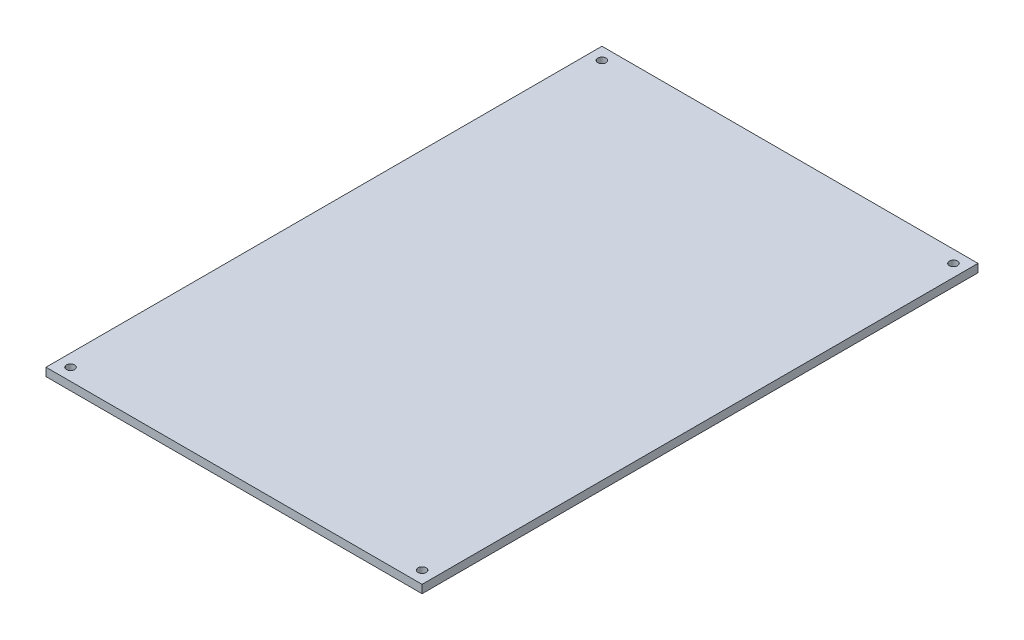
ISO-10303-21;
HEADER;
FILE_DESCRIPTION(('STEP AP214'),'2;1');
FILE_NAME('part.step','',(''),(''),'','','');
FILE_SCHEMA(('AUTOMOTIVE_DESIGN { 1 0 10303 214 1 1 1 1 }'));
ENDSEC;
DATA;
#1=APPLICATION_CONTEXT('core data for automotive mechanical design processes');
#2=APPLICATION_PROTOCOL_DEFINITION('international standard','automotive_design',2000,#1);
#3=PRODUCT_CONTEXT('',#1,'mechanical');
#4=PRODUCT('Part','Part','',(#3));
#5=PRODUCT_RELATED_PRODUCT_CATEGORY('part','',(#4));
#6=PRODUCT_DEFINITION_FORMATION('','',#4);
#7=PRODUCT_DEFINITION_CONTEXT('part definition',#1,'design');
#8=PRODUCT_DEFINITION('design','',#6,#7);
#9=PRODUCT_DEFINITION_SHAPE('','',#8);
#10=(LENGTH_UNIT() NAMED_UNIT(*) SI_UNIT(.MILLI.,.METRE.));
#11=(NAMED_UNIT(*) PLANE_ANGLE_UNIT() SI_UNIT($,.RADIAN.));
#12=(NAMED_UNIT(*) SI_UNIT($,.STERADIAN.) SOLID_ANGLE_UNIT());
#13=UNCERTAINTY_MEASURE_WITH_UNIT(LENGTH_MEASURE(1.E-05),#10,'distance_accuracy_value','');
#14=(GEOMETRIC_REPRESENTATION_CONTEXT(3) GLOBAL_UNCERTAINTY_ASSIGNED_CONTEXT((#13)) GLOBAL_UNIT_ASSIGNED_CONTEXT((#10,
#11,#12)) REPRESENTATION_CONTEXT('',''));
#15=CARTESIAN_POINT('',(0.,0.,0.));
#16=DIRECTION('',(0.,0.,1.));
#17=DIRECTION('',(1.,0.,0.));
#18=AXIS2_PLACEMENT_3D('',#15,#16,#17);
#19=CARTESIAN_POINT('',(0.,6.35,0.));
#20=DIRECTION('',(0.,-1.,0.));
#21=DIRECTION('',(0.,0.,-1.));
#22=AXIS2_PLACEMENT_3D('',#19,#20,#21);
#23=PLANE('',#22);
#24=DIRECTION('',(0.,0.,-1.));
#25=VECTOR('',#24,1.);
#26=CARTESIAN_POINT('',(146.05,6.35,215.9));
#27=LINE('',#26,#25);
#28=CARTESIAN_POINT('',(146.05,6.35,215.9));
#29=VERTEX_POINT('',#28);
#30=CARTESIAN_POINT('',(146.05,6.35,-215.9));
#31=VERTEX_POINT('',#30);
#32=EDGE_CURVE('E85',#29,#31,#27,.T.);
#33=ORIENTED_EDGE('',*,*,#32,.T.);
#34=DIRECTION('',(-1.,0.,0.));
#35=VECTOR('',#34,1.);
#36=CARTESIAN_POINT('',(-146.05,6.35,-215.9));
#37=LINE('',#36,#35);
#38=CARTESIAN_POINT('',(-146.05,6.35,-215.9));
#39=VERTEX_POINT('',#38);
#40=EDGE_CURVE('E80',#31,#39,#37,.T.);
#41=ORIENTED_EDGE('',*,*,#40,.T.);
#42=DIRECTION('',(0.,0.,1.));
#43=VECTOR('',#42,1.);
#44=CARTESIAN_POINT('',(-146.05,6.35,215.9));
#45=LINE('',#44,#43);
#46=CARTESIAN_POINT('',(-146.05,6.35,215.9));
#47=VERTEX_POINT('',#46);
#48=EDGE_CURVE('E83',#39,#47,#45,.T.);
#49=ORIENTED_EDGE('',*,*,#48,.T.);
#50=DIRECTION('',(1.,0.,0.));
#51=VECTOR('',#50,1.);
#52=CARTESIAN_POINT('',(-146.05,6.35,215.9));
#53=LINE('',#52,#51);
#54=EDGE_CURVE('E50',#47,#29,#53,.T.);
#55=ORIENTED_EDGE('',*,*,#54,.T.);
#56=EDGE_LOOP('',(#33,#41,#49,#55));
#57=FACE_BOUND('',#56,.T.);
#58=CARTESIAN_POINT('',(-136.525,6.35,-206.375));
#59=DIRECTION('',(0.,1.,0.));
#60=DIRECTION('',(0.,0.,1.));
#61=AXIS2_PLACEMENT_3D('',#58,#59,#60);
#62=CIRCLE('',#61,3.18261999999999);
#63=CARTESIAN_POINT('',(-136.525,6.35,-203.19238));
#64=VERTEX_POINT('',#63);
#65=EDGE_CURVE('E100',#64,#64,#62,.T.);
#66=ORIENTED_EDGE('',*,*,#65,.F.);
#67=EDGE_LOOP('',(#66));
#68=FACE_BOUND('',#67,.T.);
#69=CARTESIAN_POINT('',(136.525,6.35,-206.375));
#70=DIRECTION('',(0.,1.,0.));
#71=DIRECTION('',(0.,0.,1.));
#72=AXIS2_PLACEMENT_3D('',#69,#70,#71);
#73=CIRCLE('',#72,3.18261999999999);
#74=CARTESIAN_POINT('',(136.525,6.35,-203.19238));
#75=VERTEX_POINT('',#74);
#76=EDGE_CURVE('E115',#75,#75,#73,.T.);
#77=ORIENTED_EDGE('',*,*,#76,.F.);
#78=EDGE_LOOP('',(#77));
#79=FACE_BOUND('',#78,.T.);
#80=CARTESIAN_POINT('',(136.525,6.35,206.375));
#81=DIRECTION('',(0.,1.,0.));
#82=DIRECTION('',(0.,0.,1.));
#83=AXIS2_PLACEMENT_3D('',#80,#81,#82);
#84=CIRCLE('',#83,3.18261999999999);
#85=CARTESIAN_POINT('',(136.525,6.35,209.55762));
#86=VERTEX_POINT('',#85);
#87=EDGE_CURVE('E121',#86,#86,#84,.T.);
#88=ORIENTED_EDGE('',*,*,#87,.F.);
#89=EDGE_LOOP('',(#88));
#90=FACE_BOUND('',#89,.T.);
#91=CARTESIAN_POINT('',(-136.525,6.35,206.375));
#92=DIRECTION('',(0.,1.,0.));
#93=DIRECTION('',(0.,0.,1.));
#94=AXIS2_PLACEMENT_3D('',#91,#92,#93);
#95=CIRCLE('',#94,3.18261999999999);
#96=CARTESIAN_POINT('',(-136.525,6.35,209.55762));
#97=VERTEX_POINT('',#96);
#98=EDGE_CURVE('E127',#97,#97,#95,.T.);
#99=ORIENTED_EDGE('',*,*,#98,.F.);
#100=EDGE_LOOP('',(#99));
#101=FACE_BOUND('',#100,.T.);
#102=ADVANCED_FACE('F33',(#57,#68,#79,#90,#101),#23,.F.);
#103=CARTESIAN_POINT('',(0.,0.,0.));
#104=DIRECTION('',(0.,-1.,0.));
#105=DIRECTION('',(0.,0.,-1.));
#106=AXIS2_PLACEMENT_3D('',#103,#104,#105);
#107=PLANE('',#106);
#108=CARTESIAN_POINT('',(136.525,0.,206.375));
#109=DIRECTION('',(0.,1.,0.));
#110=DIRECTION('',(0.,0.,1.));
#111=AXIS2_PLACEMENT_3D('',#108,#109,#110);
#112=CIRCLE('',#111,3.18261999999999);
#113=CARTESIAN_POINT('',(136.525,0.,209.55762));
#114=VERTEX_POINT('',#113);
#115=EDGE_CURVE('E124',#114,#114,#112,.T.);
#116=ORIENTED_EDGE('',*,*,#115,.T.);
#117=EDGE_LOOP('',(#116));
#118=FACE_BOUND('',#117,.T.);
#119=CARTESIAN_POINT('',(-136.525,0.,-206.375));
#120=DIRECTION('',(0.,1.,0.));
#121=DIRECTION('',(0.,0.,1.));
#122=AXIS2_PLACEMENT_3D('',#119,#120,#121);
#123=CIRCLE('',#122,3.18261999999999);
#124=CARTESIAN_POINT('',(-136.525,0.,-203.19238));
#125=VERTEX_POINT('',#124);
#126=EDGE_CURVE('E112',#125,#125,#123,.T.);
#127=ORIENTED_EDGE('',*,*,#126,.T.);
#128=EDGE_LOOP('',(#127));
#129=FACE_BOUND('',#128,.T.);
#130=DIRECTION('',(0.,0.,-1.));
#131=VECTOR('',#130,1.);
#132=CARTESIAN_POINT('',(146.05,0.,215.9));
#133=LINE('',#132,#131);
#134=CARTESIAN_POINT('',(146.05,0.,215.9));
#135=VERTEX_POINT('',#134);
#136=CARTESIAN_POINT('',(146.05,0.,-215.9));
#137=VERTEX_POINT('',#136);
#138=EDGE_CURVE('E97',#135,#137,#133,.T.);
#139=ORIENTED_EDGE('',*,*,#138,.F.);
#140=DIRECTION('',(1.,0.,0.));
#141=VECTOR('',#140,1.);
#142=CARTESIAN_POINT('',(-146.05,0.,215.9));
#143=LINE('',#142,#141);
#144=CARTESIAN_POINT('',(-146.05,0.,215.9));
#145=VERTEX_POINT('',#144);
#146=EDGE_CURVE('E73',#145,#135,#143,.T.);
#147=ORIENTED_EDGE('',*,*,#146,.F.);
#148=DIRECTION('',(0.,0.,1.));
#149=VECTOR('',#148,1.);
#150=CARTESIAN_POINT('',(-146.05,0.,215.9));
#151=LINE('',#150,#149);
#152=CARTESIAN_POINT('',(-146.05,0.,-215.9));
#153=VERTEX_POINT('',#152);
#154=EDGE_CURVE('E67',#153,#145,#151,.T.);
#155=ORIENTED_EDGE('',*,*,#154,.F.);
#156=DIRECTION('',(-1.,0.,0.));
#157=VECTOR('',#156,1.);
#158=CARTESIAN_POINT('',(-146.05,0.,-215.9));
#159=LINE('',#158,#157);
#160=EDGE_CURVE('E89',#137,#153,#159,.T.);
#161=ORIENTED_EDGE('',*,*,#160,.F.);
#162=EDGE_LOOP('',(#139,#147,#155,#161));
#163=FACE_BOUND('',#162,.T.);
#164=CARTESIAN_POINT('',(136.525,0.,-206.375));
#165=DIRECTION('',(0.,1.,0.));
#166=DIRECTION('',(0.,0.,1.));
#167=AXIS2_PLACEMENT_3D('',#164,#165,#166);
#168=CIRCLE('',#167,3.18261999999999);
#169=CARTESIAN_POINT('',(136.525,0.,-203.19238));
#170=VERTEX_POINT('',#169);
#171=EDGE_CURVE('E118',#170,#170,#168,.T.);
#172=ORIENTED_EDGE('',*,*,#171,.T.);
#173=EDGE_LOOP('',(#172));
#174=FACE_BOUND('',#173,.T.);
#175=CARTESIAN_POINT('',(-136.525,0.,206.375));
#176=DIRECTION('',(0.,1.,0.));
#177=DIRECTION('',(0.,0.,1.));
#178=AXIS2_PLACEMENT_3D('',#175,#176,#177);
#179=CIRCLE('',#178,3.18261999999999);
#180=CARTESIAN_POINT('',(-136.525,0.,209.55762));
#181=VERTEX_POINT('',#180);
#182=EDGE_CURVE('E130',#181,#181,#179,.T.);
#183=ORIENTED_EDGE('',*,*,#182,.T.);
#184=EDGE_LOOP('',(#183));
#185=FACE_BOUND('',#184,.T.);
#186=ADVANCED_FACE('F108',(#118,#129,#163,#174,#185),#107,.T.);
#187=CARTESIAN_POINT('',(146.05,6.35,215.9));
#188=DIRECTION('',(-1.,0.,0.));
#189=DIRECTION('',(0.,0.,1.));
#190=AXIS2_PLACEMENT_3D('',#187,#188,#189);
#191=PLANE('',#190);
#192=ORIENTED_EDGE('',*,*,#138,.T.);
#193=DIRECTION('',(0.,-1.,0.));
#194=VECTOR('',#193,1.);
#195=CARTESIAN_POINT('',(146.05,6.35,-215.9));
#196=LINE('',#195,#194);
#197=EDGE_CURVE('E11',#31,#137,#196,.T.);
#198=ORIENTED_EDGE('',*,*,#197,.F.);
#199=ORIENTED_EDGE('',*,*,#32,.F.);
#200=DIRECTION('',(0.,-1.,0.));
#201=VECTOR('',#200,1.);
#202=CARTESIAN_POINT('',(146.05,6.35,215.9));
#203=LINE('',#202,#201);
#204=EDGE_CURVE('E93',#29,#135,#203,.T.);
#205=ORIENTED_EDGE('',*,*,#204,.T.);
#206=EDGE_LOOP('',(#192,#198,#199,#205));
#207=FACE_BOUND('',#206,.T.);
#208=ADVANCED_FACE('F35',(#207),#191,.F.);
#209=CARTESIAN_POINT('',(-146.05,6.35,-215.9));
#210=DIRECTION('',(0.,0.,1.));
#211=DIRECTION('',(1.,0.,0.));
#212=AXIS2_PLACEMENT_3D('',#209,#210,#211);
#213=PLANE('',#212);
#214=ORIENTED_EDGE('',*,*,#160,.T.);
#215=DIRECTION('',(0.,-1.,0.));
#216=VECTOR('',#215,1.);
#217=CARTESIAN_POINT('',(-146.05,6.35,-215.9));
#218=LINE('',#217,#216);
#219=EDGE_CURVE('E42',#39,#153,#218,.T.);
#220=ORIENTED_EDGE('',*,*,#219,.F.);
#221=ORIENTED_EDGE('',*,*,#40,.F.);
#222=ORIENTED_EDGE('',*,*,#197,.T.);
#223=EDGE_LOOP('',(#214,#220,#221,#222));
#224=FACE_BOUND('',#223,.T.);
#225=ADVANCED_FACE('F88',(#224),#213,.F.);
#226=CARTESIAN_POINT('',(-146.05,6.35,215.9));
#227=DIRECTION('',(1.,0.,0.));
#228=DIRECTION('',(0.,0.,-1.));
#229=AXIS2_PLACEMENT_3D('',#226,#227,#228);
#230=PLANE('',#229);
#231=ORIENTED_EDGE('',*,*,#154,.T.);
#232=DIRECTION('',(0.,-1.,0.));
#233=VECTOR('',#232,1.);
#234=CARTESIAN_POINT('',(-146.05,6.35,215.9));
#235=LINE('',#234,#233);
#236=EDGE_CURVE('E90',#47,#145,#235,.T.);
#237=ORIENTED_EDGE('',*,*,#236,.F.);
#238=ORIENTED_EDGE('',*,*,#48,.F.);
#239=ORIENTED_EDGE('',*,*,#219,.T.);
#240=EDGE_LOOP('',(#231,#237,#238,#239));
#241=FACE_BOUND('',#240,.T.);
#242=ADVANCED_FACE('F91',(#241),#230,.F.);
#243=CARTESIAN_POINT('',(-146.05,6.35,215.9));
#244=DIRECTION('',(0.,0.,-1.));
#245=DIRECTION('',(-1.,0.,0.));
#246=AXIS2_PLACEMENT_3D('',#243,#244,#245);
#247=PLANE('',#246);
#248=ORIENTED_EDGE('',*,*,#146,.T.);
#249=ORIENTED_EDGE('',*,*,#204,.F.);
#250=ORIENTED_EDGE('',*,*,#54,.F.);
#251=ORIENTED_EDGE('',*,*,#236,.T.);
#252=EDGE_LOOP('',(#248,#249,#250,#251));
#253=FACE_BOUND('',#252,.T.);
#254=ADVANCED_FACE('F105',(#253),#247,.F.);
#255=CARTESIAN_POINT('',(-136.525,6.35,-206.375));
#256=DIRECTION('',(0.,-1.,0.));
#257=DIRECTION('',(0.,0.,-1.));
#258=AXIS2_PLACEMENT_3D('',#255,#256,#257);
#259=CYLINDRICAL_SURFACE('',#258,3.18261999999999);
#260=ORIENTED_EDGE('',*,*,#65,.T.);
#261=EDGE_LOOP('',(#260));
#262=FACE_BOUND('',#261,.T.);
#263=ORIENTED_EDGE('',*,*,#126,.F.);
#264=EDGE_LOOP('',(#263));
#265=FACE_BOUND('',#264,.T.);
#266=ADVANCED_FACE('F147',(#262,#265),#259,.F.);
#267=CARTESIAN_POINT('',(136.525,6.35,-206.375));
#268=DIRECTION('',(0.,-1.,0.));
#269=DIRECTION('',(0.,0.,-1.));
#270=AXIS2_PLACEMENT_3D('',#267,#268,#269);
#271=CYLINDRICAL_SURFACE('',#270,3.18261999999999);
#272=ORIENTED_EDGE('',*,*,#76,.T.);
#273=EDGE_LOOP('',(#272));
#274=FACE_BOUND('',#273,.T.);
#275=ORIENTED_EDGE('',*,*,#171,.F.);
#276=EDGE_LOOP('',(#275));
#277=FACE_BOUND('',#276,.T.);
#278=ADVANCED_FACE('F193',(#274,#277),#271,.F.);
#279=CARTESIAN_POINT('',(136.525,6.35,206.375));
#280=DIRECTION('',(0.,-1.,0.));
#281=DIRECTION('',(0.,0.,-1.));
#282=AXIS2_PLACEMENT_3D('',#279,#280,#281);
#283=CYLINDRICAL_SURFACE('',#282,3.18261999999999);
#284=ORIENTED_EDGE('',*,*,#87,.T.);
#285=EDGE_LOOP('',(#284));
#286=FACE_BOUND('',#285,.T.);
#287=ORIENTED_EDGE('',*,*,#115,.F.);
#288=EDGE_LOOP('',(#287));
#289=FACE_BOUND('',#288,.T.);
#290=ADVANCED_FACE('F201',(#286,#289),#283,.F.);
#291=CARTESIAN_POINT('',(-136.525,6.35,206.375));
#292=DIRECTION('',(0.,-1.,0.));
#293=DIRECTION('',(0.,0.,-1.));
#294=AXIS2_PLACEMENT_3D('',#291,#292,#293);
#295=CYLINDRICAL_SURFACE('',#294,3.18261999999999);
#296=ORIENTED_EDGE('',*,*,#98,.T.);
#297=EDGE_LOOP('',(#296));
#298=FACE_BOUND('',#297,.T.);
#299=ORIENTED_EDGE('',*,*,#182,.F.);
#300=EDGE_LOOP('',(#299));
#301=FACE_BOUND('',#300,.T.);
#302=ADVANCED_FACE('F136',(#298,#301),#295,.F.);
#303=CLOSED_SHELL('',(#102,#186,#208,#225,#242,#254,#266,#278,#290,#302));
#304=MANIFOLD_SOLID_BREP('B2',#303);
#305=ADVANCED_BREP_SHAPE_REPRESENTATION('',(#18,#304),#14);
#306=SHAPE_DEFINITION_REPRESENTATION(#9,#305);
ENDSEC;
END-ISO-10303-21;
